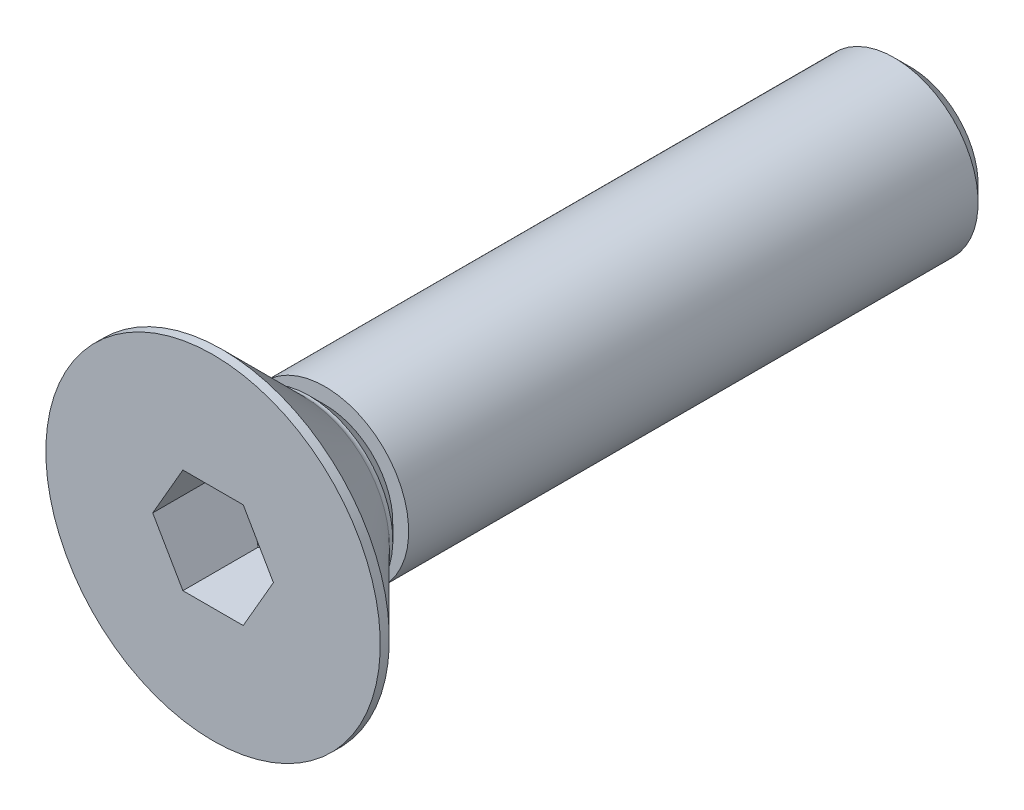
ISO-10303-21;
HEADER;
FILE_DESCRIPTION(('STEP AP214'),'2;1');
FILE_NAME('part.step','',(''),(''),'','','');
FILE_SCHEMA(('AUTOMOTIVE_DESIGN { 1 0 10303 214 1 1 1 1 }'));
ENDSEC;
DATA;
#1=APPLICATION_CONTEXT('core data for automotive mechanical design processes');
#2=APPLICATION_PROTOCOL_DEFINITION('international standard','automotive_design',2000,#1);
#3=PRODUCT_CONTEXT('',#1,'mechanical');
#4=PRODUCT('Part','Part','',(#3));
#5=PRODUCT_RELATED_PRODUCT_CATEGORY('part','',(#4));
#6=PRODUCT_DEFINITION_FORMATION('','',#4);
#7=PRODUCT_DEFINITION_CONTEXT('part definition',#1,'design');
#8=PRODUCT_DEFINITION('design','',#6,#7);
#9=PRODUCT_DEFINITION_SHAPE('','',#8);
#10=(LENGTH_UNIT() NAMED_UNIT(*) SI_UNIT(.MILLI.,.METRE.));
#11=(NAMED_UNIT(*) PLANE_ANGLE_UNIT() SI_UNIT($,.RADIAN.));
#12=(NAMED_UNIT(*) SI_UNIT($,.STERADIAN.) SOLID_ANGLE_UNIT());
#13=UNCERTAINTY_MEASURE_WITH_UNIT(LENGTH_MEASURE(1.E-05),#10,'distance_accuracy_value','');
#14=(GEOMETRIC_REPRESENTATION_CONTEXT(3) GLOBAL_UNCERTAINTY_ASSIGNED_CONTEXT((#13)) GLOBAL_UNIT_ASSIGNED_CONTEXT((#10,
#11,#12)) REPRESENTATION_CONTEXT('',''));
#15=CARTESIAN_POINT('',(0.,0.,0.));
#16=DIRECTION('',(0.,0.,1.));
#17=DIRECTION('',(1.,0.,0.));
#18=AXIS2_PLACEMENT_3D('',#15,#16,#17);
#19=CARTESIAN_POINT('',(0.,0.,-2.3));
#20=DIRECTION('',(0.,0.,-1.));
#21=DIRECTION('',(-1.,0.,0.));
#22=AXIS2_PLACEMENT_3D('',#19,#20,#21);
#23=TOROIDAL_SURFACE('',#22,2.2,0.2);
#24=CARTESIAN_POINT('',(0.,0.,-2.15857864376269));
#25=DIRECTION('',(0.,0.,-1.));
#26=DIRECTION('',(0.,1.,0.));
#27=AXIS2_PLACEMENT_3D('',#24,#25,#26);
#28=CIRCLE('',#27,2.05857864376269);
#29=CARTESIAN_POINT('',(0.,2.05857864376269,-2.15857864376269));
#30=VERTEX_POINT('',#29);
#31=EDGE_CURVE('E234',#30,#30,#28,.T.);
#32=ORIENTED_EDGE('',*,*,#31,.T.);
#33=EDGE_LOOP('',(#32));
#34=FACE_BOUND('',#33,.T.);
#35=CARTESIAN_POINT('',(0.,0.,-2.3));
#36=DIRECTION('',(0.,0.,-1.));
#37=DIRECTION('',(0.,1.,0.));
#38=AXIS2_PLACEMENT_3D('',#35,#36,#37);
#39=CIRCLE('',#38,2.);
#40=CARTESIAN_POINT('',(0.,2.,-2.3));
#41=VERTEX_POINT('',#40);
#42=EDGE_CURVE('E134',#41,#41,#39,.T.);
#43=ORIENTED_EDGE('',*,*,#42,.F.);
#44=EDGE_LOOP('',(#43));
#45=FACE_BOUND('',#44,.T.);
#46=ADVANCED_FACE('F48',(#34,#45),#23,.F.);
#47=CARTESIAN_POINT('',(0.,0.,-1.18786796564403));
#48=DIRECTION('',(0.,0.,1.));
#49=DIRECTION('',(0.,1.,0.));
#50=AXIS2_PLACEMENT_3D('',#47,#48,#49);
#51=CONICAL_SURFACE('',#50,3.02928932188135,0.785398163397448);
#52=CARTESIAN_POINT('',(0.,0.,-0.217157287525382));
#53=DIRECTION('',(0.,0.,-1.));
#54=DIRECTION('',(0.,1.,0.));
#55=AXIS2_PLACEMENT_3D('',#52,#53,#54);
#56=CIRCLE('',#55,4.);
#57=CARTESIAN_POINT('',(0.,4.,-0.217157287525382));
#58=VERTEX_POINT('',#57);
#59=EDGE_CURVE('E138',#58,#58,#56,.T.);
#60=ORIENTED_EDGE('',*,*,#59,.T.);
#61=EDGE_LOOP('',(#60));
#62=FACE_BOUND('',#61,.T.);
#63=ORIENTED_EDGE('',*,*,#31,.F.);
#64=EDGE_LOOP('',(#63));
#65=FACE_BOUND('',#64,.T.);
#66=ADVANCED_FACE('F302',(#62,#65),#51,.T.);
#67=CARTESIAN_POINT('',(0.,0.,-0.108578643762691));
#68=DIRECTION('',(0.,0.,1.));
#69=DIRECTION('',(0.,1.,0.));
#70=AXIS2_PLACEMENT_3D('',#67,#68,#69);
#71=CYLINDRICAL_SURFACE('',#70,4.);
#72=CARTESIAN_POINT('',(0.,0.,0.));
#73=DIRECTION('',(0.,0.,-1.));
#74=DIRECTION('',(0.,1.,0.));
#75=AXIS2_PLACEMENT_3D('',#72,#73,#74);
#76=CIRCLE('',#75,4.);
#77=CARTESIAN_POINT('',(0.,4.,0.));
#78=VERTEX_POINT('',#77);
#79=EDGE_CURVE('E209',#78,#78,#76,.T.);
#80=ORIENTED_EDGE('',*,*,#79,.T.);
#81=EDGE_LOOP('',(#80));
#82=FACE_BOUND('',#81,.T.);
#83=ORIENTED_EDGE('',*,*,#59,.F.);
#84=EDGE_LOOP('',(#83));
#85=FACE_BOUND('',#84,.T.);
#86=ADVANCED_FACE('F293',(#82,#85),#71,.T.);
#87=CARTESIAN_POINT('',(0.,2.,0.));
#88=DIRECTION('',(0.,0.,1.));
#89=DIRECTION('',(0.,-1.,0.));
#90=AXIS2_PLACEMENT_3D('',#87,#88,#89);
#91=PLANE('',#90);
#92=ORIENTED_EDGE('',*,*,#79,.F.);
#93=EDGE_LOOP('',(#92));
#94=FACE_BOUND('',#93,.T.);
#95=DIRECTION('',(-0.5,0.866025403784439,0.));
#96=VECTOR('',#95,1.);
#97=CARTESIAN_POINT('',(-1.51554395189222,0.125000291406317,0.));
#98=LINE('',#97,#96);
#99=CARTESIAN_POINT('',(-0.7216875,-1.24999941718736,0.));
#100=VERTEX_POINT('',#99);
#101=CARTESIAN_POINT('',(-1.443375,0.,0.));
#102=VERTEX_POINT('',#101);
#103=EDGE_CURVE('E221',#100,#102,#98,.T.);
#104=ORIENTED_EDGE('',*,*,#103,.T.);
#105=DIRECTION('',(0.5,0.866025403784439,0.));
#106=VECTOR('',#105,1.);
#107=CARTESIAN_POINT('',(-0.649518548107781,1.37499970859368,0.));
#108=LINE('',#107,#106);
#109=CARTESIAN_POINT('',(-0.7216875,1.24999941718736,0.));
#110=VERTEX_POINT('',#109);
#111=EDGE_CURVE('E65',#102,#110,#108,.T.);
#112=ORIENTED_EDGE('',*,*,#111,.T.);
#113=DIRECTION('',(1.,0.,0.));
#114=VECTOR('',#113,1.);
#115=CARTESIAN_POINT('',(0.,1.24999941718736,0.));
#116=LINE('',#115,#114);
#117=CARTESIAN_POINT('',(0.7216875,1.24999941718736,0.));
#118=VERTEX_POINT('',#117);
#119=EDGE_CURVE('E166',#110,#118,#116,.T.);
#120=ORIENTED_EDGE('',*,*,#119,.T.);
#121=DIRECTION('',(0.5,-0.866025403784439,0.));
#122=VECTOR('',#121,1.);
#123=CARTESIAN_POINT('',(0.649518548107781,1.37499970859368,0.));
#124=LINE('',#123,#122);
#125=CARTESIAN_POINT('',(1.443375,0.,0.));
#126=VERTEX_POINT('',#125);
#127=EDGE_CURVE('E128',#118,#126,#124,.T.);
#128=ORIENTED_EDGE('',*,*,#127,.T.);
#129=DIRECTION('',(-0.5,-0.866025403784439,0.));
#130=VECTOR('',#129,1.);
#131=CARTESIAN_POINT('',(1.51554395189222,0.125000291406318,0.));
#132=LINE('',#131,#130);
#133=CARTESIAN_POINT('',(0.7216875,-1.24999941718736,0.));
#134=VERTEX_POINT('',#133);
#135=EDGE_CURVE('E247',#126,#134,#132,.T.);
#136=ORIENTED_EDGE('',*,*,#135,.T.);
#137=DIRECTION('',(-1.,0.,0.));
#138=VECTOR('',#137,1.);
#139=CARTESIAN_POINT('',(0.,-1.24999941718736,0.));
#140=LINE('',#139,#138);
#141=EDGE_CURVE('E201',#134,#100,#140,.T.);
#142=ORIENTED_EDGE('',*,*,#141,.T.);
#143=EDGE_LOOP('',(#104,#112,#120,#128,#136,#142));
#144=FACE_BOUND('',#143,.T.);
#145=ADVANCED_FACE('F290',(#94,#144),#91,.T.);
#146=CARTESIAN_POINT('',(-1.08253125,0.624999708593682,1.));
#147=DIRECTION('',(-0.866025403784439,0.5,0.));
#148=DIRECTION('',(0.5,0.866025403784439,0.));
#149=AXIS2_PLACEMENT_3D('',#146,#147,#148);
#150=PLANE('',#149);
#151=ORIENTED_EDGE('',*,*,#111,.F.);
#152=DIRECTION('',(0.,0.,-1.));
#153=VECTOR('',#152,1.);
#154=CARTESIAN_POINT('',(-1.443375,0.,1.));
#155=LINE('',#154,#153);
#156=CARTESIAN_POINT('',(-1.443375,0.,-1.8));
#157=VERTEX_POINT('',#156);
#158=EDGE_CURVE('E173',#102,#157,#155,.T.);
#159=ORIENTED_EDGE('',*,*,#158,.T.);
#160=CARTESIAN_POINT('',(-1.443375,0.,-1.8));
#161=CARTESIAN_POINT('',(-1.08253125,0.624999708593685,-2.0083332361979));
#162=CARTESIAN_POINT('',(-0.7216875,1.24999941718736,-1.8));
#163=(BOUNDED_CURVE() B_SPLINE_CURVE(2,(#160,#161,#162),.UNSPECIFIED.,.F.,
.F.) B_SPLINE_CURVE_WITH_KNOTS((3,3),(0.,1.46054449161805),
.UNSPECIFIED.) CURVE() GEOMETRIC_REPRESENTATION_ITEM() RATIONAL_B_SPLINE_CURVE((1.,
1.15470053837925,1.)) REPRESENTATION_ITEM(''));
#164=CARTESIAN_POINT('',(-0.7216875,1.24999941718736,-1.8));
#165=VERTEX_POINT('',#164);
#166=EDGE_CURVE('E112',#157,#165,#163,.T.);
#167=ORIENTED_EDGE('',*,*,#166,.T.);
#168=DIRECTION('',(0.,0.,-1.));
#169=VECTOR('',#168,1.);
#170=CARTESIAN_POINT('',(-0.7216875,1.24999941718736,1.));
#171=LINE('',#170,#169);
#172=EDGE_CURVE('E107',#110,#165,#171,.T.);
#173=ORIENTED_EDGE('',*,*,#172,.F.);
#174=EDGE_LOOP('',(#151,#159,#167,#173));
#175=FACE_BOUND('',#174,.T.);
#176=ADVANCED_FACE('F292',(#175),#150,.F.);
#177=CARTESIAN_POINT('',(0.,1.24999941718736,1.));
#178=DIRECTION('',(0.,1.,0.));
#179=DIRECTION('',(1.,0.,0.));
#180=AXIS2_PLACEMENT_3D('',#177,#178,#179);
#181=PLANE('',#180);
#182=ORIENTED_EDGE('',*,*,#119,.F.);
#183=ORIENTED_EDGE('',*,*,#172,.T.);
#184=CARTESIAN_POINT('',(-0.7216875,1.24999941718736,-1.8));
#185=CARTESIAN_POINT('',(0.,1.24999941718737,-2.0083332361979));
#186=CARTESIAN_POINT('',(0.7216875,1.24999941718736,-1.8));
#187=(BOUNDED_CURVE() B_SPLINE_CURVE(2,(#184,#185,#186),.UNSPECIFIED.,.F.,
.F.) B_SPLINE_CURVE_WITH_KNOTS((3,3),(0.,1.46054449161806),
.UNSPECIFIED.) CURVE() GEOMETRIC_REPRESENTATION_ITEM() RATIONAL_B_SPLINE_CURVE((1.,
1.15470053837925,1.)) REPRESENTATION_ITEM(''));
#188=CARTESIAN_POINT('',(0.7216875,1.24999941718736,-1.8));
#189=VERTEX_POINT('',#188);
#190=EDGE_CURVE('E100',#165,#189,#187,.T.);
#191=ORIENTED_EDGE('',*,*,#190,.T.);
#192=DIRECTION('',(0.,0.,-1.));
#193=VECTOR('',#192,1.);
#194=CARTESIAN_POINT('',(0.7216875,1.24999941718736,1.));
#195=LINE('',#194,#193);
#196=EDGE_CURVE('E105',#118,#189,#195,.T.);
#197=ORIENTED_EDGE('',*,*,#196,.F.);
#198=EDGE_LOOP('',(#182,#183,#191,#197));
#199=FACE_BOUND('',#198,.T.);
#200=ADVANCED_FACE('F103',(#199),#181,.F.);
#201=CARTESIAN_POINT('',(-1.08253125,-0.624999708593682,1.));
#202=DIRECTION('',(-0.866025403784439,-0.5,0.));
#203=DIRECTION('',(-0.5,0.866025403784439,0.));
#204=AXIS2_PLACEMENT_3D('',#201,#202,#203);
#205=PLANE('',#204);
#206=ORIENTED_EDGE('',*,*,#103,.F.);
#207=DIRECTION('',(0.,0.,-1.));
#208=VECTOR('',#207,1.);
#209=CARTESIAN_POINT('',(-0.7216875,-1.24999941718736,1.));
#210=LINE('',#209,#208);
#211=CARTESIAN_POINT('',(-0.7216875,-1.24999941718736,-1.8));
#212=VERTEX_POINT('',#211);
#213=EDGE_CURVE('E113',#100,#212,#210,.T.);
#214=ORIENTED_EDGE('',*,*,#213,.T.);
#215=CARTESIAN_POINT('',(-0.7216875,-1.24999941718736,-1.8));
#216=CARTESIAN_POINT('',(-1.08253125,-0.624999708593682,-2.0083332361979));
#217=CARTESIAN_POINT('',(-1.443375,0.,-1.8));
#218=(BOUNDED_CURVE() B_SPLINE_CURVE(2,(#215,#216,#217),.UNSPECIFIED.,.F.,
.F.) B_SPLINE_CURVE_WITH_KNOTS((3,3),(0.,1.46054449161805),
.UNSPECIFIED.) CURVE() GEOMETRIC_REPRESENTATION_ITEM() RATIONAL_B_SPLINE_CURVE((1.,
1.15470053837925,1.)) REPRESENTATION_ITEM(''));
#219=EDGE_CURVE('E177',#212,#157,#218,.T.);
#220=ORIENTED_EDGE('',*,*,#219,.T.);
#221=ORIENTED_EDGE('',*,*,#158,.F.);
#222=EDGE_LOOP('',(#206,#214,#220,#221));
#223=FACE_BOUND('',#222,.T.);
#224=ADVANCED_FACE('F328',(#223),#205,.F.);
#225=CARTESIAN_POINT('',(0.,0.,-2.21666647239579));
#226=DIRECTION('',(0.,0.,1.));
#227=DIRECTION('',(0.,1.,0.));
#228=AXIS2_PLACEMENT_3D('',#225,#226,#227);
#229=CONICAL_SURFACE('',#228,0.7216875,1.0471975511966);
#230=CARTESIAN_POINT('',(0.,0.,-2.63333294479158));
#231=VERTEX_POINT('',#230);
#232=VERTEX_LOOP('',#231);
#233=FACE_BOUND('',#232,.T.);
#234=CARTESIAN_POINT('',(0.7216875,1.24999941718736,-1.8));
#235=CARTESIAN_POINT('',(1.08253125,0.624999708593683,-2.00833323619789));
#236=CARTESIAN_POINT('',(1.443375,0.,-1.8));
#237=(BOUNDED_CURVE() B_SPLINE_CURVE(2,(#234,#235,#236),.UNSPECIFIED.,.F.,
.F.) B_SPLINE_CURVE_WITH_KNOTS((3,3),(0.,1.46054449161805),
.UNSPECIFIED.) CURVE() GEOMETRIC_REPRESENTATION_ITEM() RATIONAL_B_SPLINE_CURVE((1.,
1.15470053837925,1.)) REPRESENTATION_ITEM(''));
#238=CARTESIAN_POINT('',(1.443375,0.,-1.8));
#239=VERTEX_POINT('',#238);
#240=EDGE_CURVE('E116',#189,#239,#237,.T.);
#241=ORIENTED_EDGE('',*,*,#240,.F.);
#242=ORIENTED_EDGE('',*,*,#190,.F.);
#243=ORIENTED_EDGE('',*,*,#166,.F.);
#244=ORIENTED_EDGE('',*,*,#219,.F.);
#245=CARTESIAN_POINT('',(0.7216875,-1.24999941718736,-1.8));
#246=CARTESIAN_POINT('',(0.,-1.24999941718737,-2.0083332361979));
#247=CARTESIAN_POINT('',(-0.7216875,-1.24999941718736,-1.8));
#248=(BOUNDED_CURVE() B_SPLINE_CURVE(2,(#245,#246,#247),.UNSPECIFIED.,.F.,
.F.) B_SPLINE_CURVE_WITH_KNOTS((3,3),(0.,1.46054449161806),
.UNSPECIFIED.) CURVE() GEOMETRIC_REPRESENTATION_ITEM() RATIONAL_B_SPLINE_CURVE((1.,
1.15470053837925,1.)) REPRESENTATION_ITEM(''));
#249=CARTESIAN_POINT('',(0.7216875,-1.24999941718736,-1.8));
#250=VERTEX_POINT('',#249);
#251=EDGE_CURVE('E155',#250,#212,#248,.T.);
#252=ORIENTED_EDGE('',*,*,#251,.F.);
#253=CARTESIAN_POINT('',(1.443375,0.,-1.8));
#254=CARTESIAN_POINT('',(1.08253125,-0.624999708593683,-2.00833323619789));
#255=CARTESIAN_POINT('',(0.7216875,-1.24999941718736,-1.8));
#256=(BOUNDED_CURVE() B_SPLINE_CURVE(2,(#253,#254,#255),.UNSPECIFIED.,.F.,
.F.) B_SPLINE_CURVE_WITH_KNOTS((3,3),(0.,1.46054449161805),
.UNSPECIFIED.) CURVE() GEOMETRIC_REPRESENTATION_ITEM() RATIONAL_B_SPLINE_CURVE((1.,
1.15470053837925,1.)) REPRESENTATION_ITEM(''));
#257=EDGE_CURVE('E119',#239,#250,#256,.T.);
#258=ORIENTED_EDGE('',*,*,#257,.F.);
#259=EDGE_LOOP('',(#241,#242,#243,#244,#252,#258));
#260=FACE_BOUND('',#259,.T.);
#261=ADVANCED_FACE('F117',(#233,#260),#229,.F.);
#262=CARTESIAN_POINT('',(0.,-1.24999941718736,1.));
#263=DIRECTION('',(0.,-1.,0.));
#264=DIRECTION('',(-1.,0.,0.));
#265=AXIS2_PLACEMENT_3D('',#262,#263,#264);
#266=PLANE('',#265);
#267=ORIENTED_EDGE('',*,*,#141,.F.);
#268=DIRECTION('',(0.,0.,-1.));
#269=VECTOR('',#268,1.);
#270=CARTESIAN_POINT('',(0.7216875,-1.24999941718736,1.));
#271=LINE('',#270,#269);
#272=EDGE_CURVE('E141',#134,#250,#271,.T.);
#273=ORIENTED_EDGE('',*,*,#272,.T.);
#274=ORIENTED_EDGE('',*,*,#251,.T.);
#275=ORIENTED_EDGE('',*,*,#213,.F.);
#276=EDGE_LOOP('',(#267,#273,#274,#275));
#277=FACE_BOUND('',#276,.T.);
#278=ADVANCED_FACE('F318',(#277),#266,.F.);
#279=CARTESIAN_POINT('',(1.08253125,-0.624999708593682,1.));
#280=DIRECTION('',(0.866025403784439,-0.5,0.));
#281=DIRECTION('',(-0.5,-0.866025403784439,0.));
#282=AXIS2_PLACEMENT_3D('',#279,#280,#281);
#283=PLANE('',#282);
#284=ORIENTED_EDGE('',*,*,#135,.F.);
#285=DIRECTION('',(0.,0.,-1.));
#286=VECTOR('',#285,1.);
#287=CARTESIAN_POINT('',(1.443375,0.,1.));
#288=LINE('',#287,#286);
#289=EDGE_CURVE('E124',#126,#239,#288,.T.);
#290=ORIENTED_EDGE('',*,*,#289,.T.);
#291=ORIENTED_EDGE('',*,*,#257,.T.);
#292=ORIENTED_EDGE('',*,*,#272,.F.);
#293=EDGE_LOOP('',(#284,#290,#291,#292));
#294=FACE_BOUND('',#293,.T.);
#295=ADVANCED_FACE('F288',(#294),#283,.F.);
#296=CARTESIAN_POINT('',(1.08253125,0.624999708593682,1.));
#297=DIRECTION('',(0.866025403784439,0.5,0.));
#298=DIRECTION('',(0.5,-0.866025403784439,0.));
#299=AXIS2_PLACEMENT_3D('',#296,#297,#298);
#300=PLANE('',#299);
#301=ORIENTED_EDGE('',*,*,#127,.F.);
#302=ORIENTED_EDGE('',*,*,#196,.T.);
#303=ORIENTED_EDGE('',*,*,#240,.T.);
#304=ORIENTED_EDGE('',*,*,#289,.F.);
#305=EDGE_LOOP('',(#301,#302,#303,#304));
#306=FACE_BOUND('',#305,.T.);
#307=ADVANCED_FACE('F126',(#306),#300,.F.);
#308=CARTESIAN_POINT('',(0.,0.,-2.4894375));
#309=DIRECTION('',(0.,0.,1.));
#310=DIRECTION('',(0.,1.,0.));
#311=AXIS2_PLACEMENT_3D('',#308,#309,#310);
#312=CONICAL_SURFACE('',#311,1.8105625,0.785398163397448);
#313=CARTESIAN_POINT('',(0.,0.,-2.678875));
#314=DIRECTION('',(0.,0.,-1.));
#315=DIRECTION('',(-1.,0.,0.));
#316=AXIS2_PLACEMENT_3D('',#313,#314,#315);
#317=CIRCLE('',#316,1.621125);
#318=CARTESIAN_POINT('',(-1.621125,0.,-2.678875));
#319=VERTEX_POINT('',#318);
#320=EDGE_CURVE('E597',#319,#319,#317,.F.);
#321=ORIENTED_EDGE('',*,*,#320,.T.);
#322=EDGE_LOOP('',(#321));
#323=FACE_BOUND('',#322,.T.);
#324=ORIENTED_EDGE('',*,*,#42,.T.);
#325=EDGE_LOOP('',(#324));
#326=FACE_BOUND('',#325,.T.);
#327=ADVANCED_FACE('F316',(#323,#326),#312,.T.);
#328=CARTESIAN_POINT('',(0.,0.,-16.678875));
#329=DIRECTION('',(0.,0.,1.));
#330=DIRECTION('',(1.,0.,0.));
#331=AXIS2_PLACEMENT_3D('',#328,#329,#330);
#332=CYLINDRICAL_SURFACE('',#331,2.);
#333=CARTESIAN_POINT('',(0.,0.,-16.3));
#334=DIRECTION('',(0.,0.,-1.));
#335=DIRECTION('',(-1.,0.,0.));
#336=AXIS2_PLACEMENT_3D('',#333,#334,#335);
#337=CIRCLE('',#336,2.);
#338=CARTESIAN_POINT('',(-2.,0.,-16.3));
#339=VERTEX_POINT('',#338);
#340=EDGE_CURVE('E58',#339,#339,#337,.F.);
#341=ORIENTED_EDGE('',*,*,#340,.T.);
#342=EDGE_LOOP('',(#341));
#343=FACE_BOUND('',#342,.T.);
#344=CARTESIAN_POINT('',(0.,0.,-2.678875));
#345=DIRECTION('',(0.,0.,1.));
#346=DIRECTION('',(-1.,0.,0.));
#347=AXIS2_PLACEMENT_3D('',#344,#345,#346);
#348=CIRCLE('',#347,2.);
#349=CARTESIAN_POINT('',(-2.,0.,-2.678875));
#350=VERTEX_POINT('',#349);
#351=EDGE_CURVE('E605',#350,#350,#348,.T.);
#352=ORIENTED_EDGE('',*,*,#351,.F.);
#353=EDGE_LOOP('',(#352));
#354=FACE_BOUND('',#353,.T.);
#355=ADVANCED_FACE('F335',(#343,#354),#332,.T.);
#356=CARTESIAN_POINT('',(0.,0.,-16.678875));
#357=DIRECTION('',(0.,0.,-1.));
#358=DIRECTION('',(-1.,0.,0.));
#359=AXIS2_PLACEMENT_3D('',#356,#357,#358);
#360=PLANE('',#359);
#361=CARTESIAN_POINT('',(0.,0.,-16.678875));
#362=DIRECTION('',(0.,0.,-1.));
#363=DIRECTION('',(-1.,0.,0.));
#364=AXIS2_PLACEMENT_3D('',#361,#362,#363);
#365=CIRCLE('',#364,1.621125);
#366=CARTESIAN_POINT('',(-1.621125,0.,-16.678875));
#367=VERTEX_POINT('',#366);
#368=EDGE_CURVE('E12',#367,#367,#365,.T.);
#369=ORIENTED_EDGE('',*,*,#368,.T.);
#370=EDGE_LOOP('',(#369));
#371=FACE_BOUND('',#370,.T.);
#372=ADVANCED_FACE('F338',(#371),#360,.T.);
#373=CARTESIAN_POINT('',(0.,0.,-2.678875));
#374=DIRECTION('',(0.,0.,-1.));
#375=DIRECTION('',(-1.,0.,0.));
#376=AXIS2_PLACEMENT_3D('',#373,#374,#375);
#377=PLANE('',#376);
#378=ORIENTED_EDGE('',*,*,#320,.F.);
#379=EDGE_LOOP('',(#378));
#380=FACE_BOUND('',#379,.T.);
#381=ORIENTED_EDGE('',*,*,#351,.T.);
#382=EDGE_LOOP('',(#381));
#383=FACE_BOUND('',#382,.T.);
#384=ADVANCED_FACE('F339',(#380,#383),#377,.F.);
#385=CARTESIAN_POINT('',(0.,0.,-16.3));
#386=DIRECTION('',(0.,0.,1.));
#387=DIRECTION('',(1.,0.,0.));
#388=AXIS2_PLACEMENT_3D('',#385,#386,#387);
#389=CONICAL_SURFACE('',#388,2.,0.785398163397451);
#390=ORIENTED_EDGE('',*,*,#368,.F.);
#391=EDGE_LOOP('',(#390));
#392=FACE_BOUND('',#391,.T.);
#393=ORIENTED_EDGE('',*,*,#340,.F.);
#394=EDGE_LOOP('',(#393));
#395=FACE_BOUND('',#394,.T.);
#396=ADVANCED_FACE('F51',(#392,#395),#389,.T.);
#397=CLOSED_SHELL('',(#46,#66,#86,#145,#176,#200,#224,#261,#278,#295,#307,#327,#355,#372,#384,#396));
#398=MANIFOLD_SOLID_BREP('B2',#397);
#399=ADVANCED_BREP_SHAPE_REPRESENTATION('',(#18,#398),#14);
#400=SHAPE_DEFINITION_REPRESENTATION(#9,#399);
ENDSEC;
END-ISO-10303-21;
